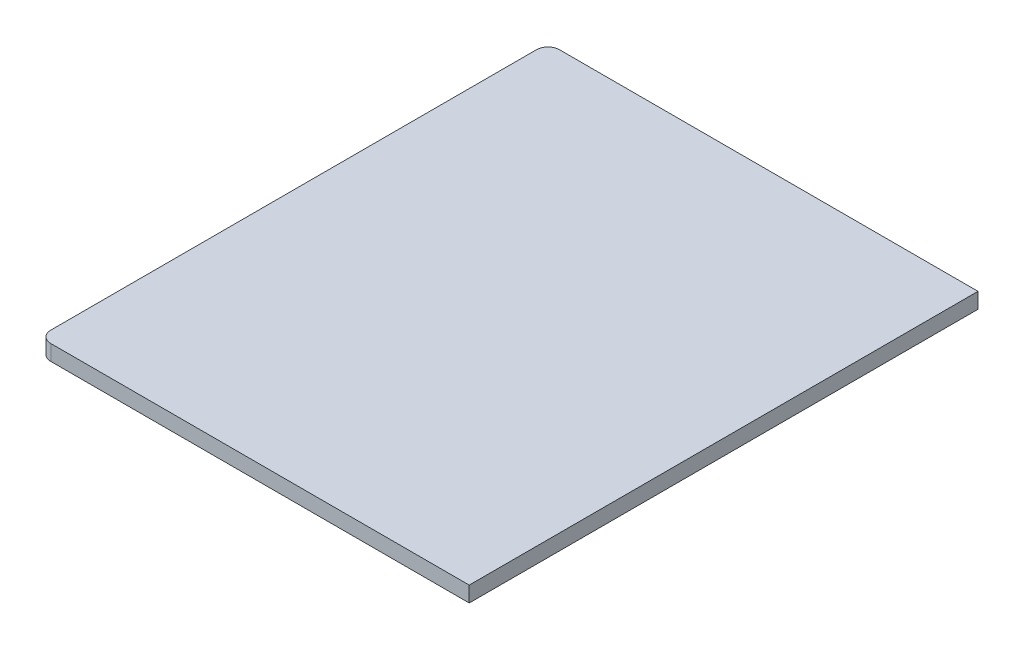
ISO-10303-21;
HEADER;
FILE_DESCRIPTION(('STEP AP214'),'2;1');
FILE_NAME('part.step','',(''),(''),'','','');
FILE_SCHEMA(('AUTOMOTIVE_DESIGN { 1 0 10303 214 1 1 1 1 }'));
ENDSEC;
DATA;
#1=APPLICATION_CONTEXT('core data for automotive mechanical design processes');
#2=APPLICATION_PROTOCOL_DEFINITION('international standard','automotive_design',2000,#1);
#3=PRODUCT_CONTEXT('',#1,'mechanical');
#4=PRODUCT('Part','Part','',(#3));
#5=PRODUCT_RELATED_PRODUCT_CATEGORY('part','',(#4));
#6=PRODUCT_DEFINITION_FORMATION('','',#4);
#7=PRODUCT_DEFINITION_CONTEXT('part definition',#1,'design');
#8=PRODUCT_DEFINITION('design','',#6,#7);
#9=PRODUCT_DEFINITION_SHAPE('','',#8);
#10=(LENGTH_UNIT() NAMED_UNIT(*) SI_UNIT(.MILLI.,.METRE.));
#11=(NAMED_UNIT(*) PLANE_ANGLE_UNIT() SI_UNIT($,.RADIAN.));
#12=(NAMED_UNIT(*) SI_UNIT($,.STERADIAN.) SOLID_ANGLE_UNIT());
#13=UNCERTAINTY_MEASURE_WITH_UNIT(LENGTH_MEASURE(1.E-05),#10,'distance_accuracy_value','');
#14=(GEOMETRIC_REPRESENTATION_CONTEXT(3) GLOBAL_UNCERTAINTY_ASSIGNED_CONTEXT((#13)) GLOBAL_UNIT_ASSIGNED_CONTEXT((#10,
#11,#12)) REPRESENTATION_CONTEXT('',''));
#15=CARTESIAN_POINT('',(0.,0.,0.));
#16=DIRECTION('',(0.,0.,1.));
#17=DIRECTION('',(1.,0.,0.));
#18=AXIS2_PLACEMENT_3D('',#15,#16,#17);
#19=CARTESIAN_POINT('',(-105.9,3.9,0.));
#20=DIRECTION('',(-1.,0.,0.));
#21=DIRECTION('',(0.,0.,1.));
#22=AXIS2_PLACEMENT_3D('',#19,#20,#21);
#23=PLANE('',#22);
#24=DIRECTION('',(0.,0.,-1.));
#25=VECTOR('',#24,1.);
#26=CARTESIAN_POINT('',(-105.9,0.,0.));
#27=LINE('',#26,#25);
#28=CARTESIAN_POINT('',(-105.9,0.,60.9297943852697));
#29=VERTEX_POINT('',#28);
#30=CARTESIAN_POINT('',(-105.9,0.,-60.9297943852697));
#31=VERTEX_POINT('',#30);
#32=EDGE_CURVE('E133',#29,#31,#27,.T.);
#33=ORIENTED_EDGE('',*,*,#32,.F.);
#34=DIRECTION('',(0.,-1.,0.));
#35=VECTOR('',#34,1.);
#36=CARTESIAN_POINT('',(-105.9,3.9,60.9297943852697));
#37=LINE('',#36,#35);
#38=CARTESIAN_POINT('',(-105.9,3.9,60.9297943852697));
#39=VERTEX_POINT('',#38);
#40=EDGE_CURVE('E11',#39,#29,#37,.T.);
#41=ORIENTED_EDGE('',*,*,#40,.F.);
#42=DIRECTION('',(0.,0.,-1.));
#43=VECTOR('',#42,1.);
#44=CARTESIAN_POINT('',(-105.9,3.9,0.));
#45=LINE('',#44,#43);
#46=CARTESIAN_POINT('',(-105.9,3.9,-60.9297943852697));
#47=VERTEX_POINT('',#46);
#48=EDGE_CURVE('E153',#39,#47,#45,.T.);
#49=ORIENTED_EDGE('',*,*,#48,.T.);
#50=DIRECTION('',(0.,-1.,0.));
#51=VECTOR('',#50,1.);
#52=CARTESIAN_POINT('',(-105.9,3.9,-60.9297943852697));
#53=LINE('',#52,#51);
#54=EDGE_CURVE('E92',#47,#31,#53,.T.);
#55=ORIENTED_EDGE('',*,*,#54,.T.);
#56=EDGE_LOOP('',(#33,#41,#49,#55));
#57=FACE_BOUND('',#56,.T.);
#58=ADVANCED_FACE('F47',(#57),#23,.T.);
#59=CARTESIAN_POINT('',(-103.,3.9,60.9297943852697));
#60=DIRECTION('',(0.,-1.,0.));
#61=DIRECTION('',(0.,0.,-1.));
#62=AXIS2_PLACEMENT_3D('',#59,#60,#61);
#63=CYLINDRICAL_SURFACE('',#62,2.90000000000002);
#64=CARTESIAN_POINT('',(-103.,0.,60.9297943852697));
#65=DIRECTION('',(0.,1.,0.));
#66=DIRECTION('',(0.,0.,1.));
#67=AXIS2_PLACEMENT_3D('',#64,#65,#66);
#68=CIRCLE('',#67,2.90000000000002);
#69=CARTESIAN_POINT('',(-103.,0.,63.8297943852697));
#70=VERTEX_POINT('',#69);
#71=EDGE_CURVE('E137',#29,#70,#68,.T.);
#72=ORIENTED_EDGE('',*,*,#71,.T.);
#73=DIRECTION('',(0.,-1.,0.));
#74=VECTOR('',#73,1.);
#75=CARTESIAN_POINT('',(-103.,3.9,63.8297943852697));
#76=LINE('',#75,#74);
#77=CARTESIAN_POINT('',(-103.,3.9,63.8297943852697));
#78=VERTEX_POINT('',#77);
#79=EDGE_CURVE('E56',#78,#70,#76,.T.);
#80=ORIENTED_EDGE('',*,*,#79,.F.);
#81=CARTESIAN_POINT('',(-103.,3.9,60.9297943852697));
#82=DIRECTION('',(0.,1.,0.));
#83=DIRECTION('',(0.,0.,1.));
#84=AXIS2_PLACEMENT_3D('',#81,#82,#83);
#85=CIRCLE('',#84,2.90000000000002);
#86=EDGE_CURVE('E171',#39,#78,#85,.T.);
#87=ORIENTED_EDGE('',*,*,#86,.F.);
#88=ORIENTED_EDGE('',*,*,#40,.T.);
#89=EDGE_LOOP('',(#72,#80,#87,#88));
#90=FACE_BOUND('',#89,.T.);
#91=ADVANCED_FACE('F228',(#90),#63,.T.);
#92=CARTESIAN_POINT('',(0.,3.9,63.8297943852697));
#93=DIRECTION('',(0.,0.,-1.));
#94=DIRECTION('',(-1.,0.,0.));
#95=AXIS2_PLACEMENT_3D('',#92,#93,#94);
#96=PLANE('',#95);
#97=DIRECTION('',(1.,0.,0.));
#98=VECTOR('',#97,1.);
#99=CARTESIAN_POINT('',(0.,0.,63.8297943852697));
#100=LINE('',#99,#98);
#101=CARTESIAN_POINT('',(2.,0.,63.8297943852697));
#102=VERTEX_POINT('',#101);
#103=EDGE_CURVE('E141',#70,#102,#100,.T.);
#104=ORIENTED_EDGE('',*,*,#103,.T.);
#105=DIRECTION('',(0.,-1.,0.));
#106=VECTOR('',#105,1.);
#107=CARTESIAN_POINT('',(2.,3.9,63.8297943852697));
#108=LINE('',#107,#106);
#109=CARTESIAN_POINT('',(2.,3.9,63.8297943852697));
#110=VERTEX_POINT('',#109);
#111=EDGE_CURVE('E117',#110,#102,#108,.T.);
#112=ORIENTED_EDGE('',*,*,#111,.F.);
#113=DIRECTION('',(1.,0.,0.));
#114=VECTOR('',#113,1.);
#115=CARTESIAN_POINT('',(0.,3.9,63.8297943852697));
#116=LINE('',#115,#114);
#117=EDGE_CURVE('E122',#78,#110,#116,.T.);
#118=ORIENTED_EDGE('',*,*,#117,.F.);
#119=ORIENTED_EDGE('',*,*,#79,.T.);
#120=EDGE_LOOP('',(#104,#112,#118,#119));
#121=FACE_BOUND('',#120,.T.);
#122=ADVANCED_FACE('F164',(#121),#96,.F.);
#123=CARTESIAN_POINT('',(2.,3.9,0.));
#124=DIRECTION('',(1.,0.,0.));
#125=DIRECTION('',(0.,0.,-1.));
#126=AXIS2_PLACEMENT_3D('',#123,#124,#125);
#127=PLANE('',#126);
#128=DIRECTION('',(0.,0.,1.));
#129=VECTOR('',#128,1.);
#130=CARTESIAN_POINT('',(2.,0.,0.));
#131=LINE('',#130,#129);
#132=CARTESIAN_POINT('',(2.,0.,-63.8297943852697));
#133=VERTEX_POINT('',#132);
#134=EDGE_CURVE('E111',#133,#102,#131,.T.);
#135=ORIENTED_EDGE('',*,*,#134,.F.);
#136=DIRECTION('',(0.,-1.,0.));
#137=VECTOR('',#136,1.);
#138=CARTESIAN_POINT('',(2.,3.9,-63.8297943852697));
#139=LINE('',#138,#137);
#140=CARTESIAN_POINT('',(2.,3.9,-63.8297943852697));
#141=VERTEX_POINT('',#140);
#142=EDGE_CURVE('E106',#141,#133,#139,.T.);
#143=ORIENTED_EDGE('',*,*,#142,.F.);
#144=DIRECTION('',(0.,0.,1.));
#145=VECTOR('',#144,1.);
#146=CARTESIAN_POINT('',(2.,3.9,0.));
#147=LINE('',#146,#145);
#148=EDGE_CURVE('E109',#141,#110,#147,.T.);
#149=ORIENTED_EDGE('',*,*,#148,.T.);
#150=ORIENTED_EDGE('',*,*,#111,.T.);
#151=EDGE_LOOP('',(#135,#143,#149,#150));
#152=FACE_BOUND('',#151,.T.);
#153=ADVANCED_FACE('F108',(#152),#127,.T.);
#154=CARTESIAN_POINT('',(0.,3.9,-63.8297943852697));
#155=DIRECTION('',(0.,0.,-1.));
#156=DIRECTION('',(-1.,0.,0.));
#157=AXIS2_PLACEMENT_3D('',#154,#155,#156);
#158=PLANE('',#157);
#159=DIRECTION('',(1.,0.,0.));
#160=VECTOR('',#159,1.);
#161=CARTESIAN_POINT('',(0.,0.,-63.8297943852697));
#162=LINE('',#161,#160);
#163=CARTESIAN_POINT('',(-103.,0.,-63.8297943852697));
#164=VERTEX_POINT('',#163);
#165=EDGE_CURVE('E147',#164,#133,#162,.T.);
#166=ORIENTED_EDGE('',*,*,#165,.F.);
#167=DIRECTION('',(0.,-1.,0.));
#168=VECTOR('',#167,1.);
#169=CARTESIAN_POINT('',(-103.,3.9,-63.8297943852697));
#170=LINE('',#169,#168);
#171=CARTESIAN_POINT('',(-103.,3.9,-63.8297943852697));
#172=VERTEX_POINT('',#171);
#173=EDGE_CURVE('E85',#172,#164,#170,.T.);
#174=ORIENTED_EDGE('',*,*,#173,.F.);
#175=DIRECTION('',(1.,0.,0.));
#176=VECTOR('',#175,1.);
#177=CARTESIAN_POINT('',(0.,3.9,-63.8297943852697));
#178=LINE('',#177,#176);
#179=EDGE_CURVE('E120',#172,#141,#178,.T.);
#180=ORIENTED_EDGE('',*,*,#179,.T.);
#181=ORIENTED_EDGE('',*,*,#142,.T.);
#182=EDGE_LOOP('',(#166,#174,#180,#181));
#183=FACE_BOUND('',#182,.T.);
#184=ADVANCED_FACE('F126',(#183),#158,.T.);
#185=CARTESIAN_POINT('',(-103.,3.9,-60.9297943852697));
#186=DIRECTION('',(0.,-1.,0.));
#187=DIRECTION('',(0.,0.,-1.));
#188=AXIS2_PLACEMENT_3D('',#185,#186,#187);
#189=CYLINDRICAL_SURFACE('',#188,2.90000000000002);
#190=CARTESIAN_POINT('',(-103.,0.,-60.9297943852697));
#191=DIRECTION('',(0.,1.,0.));
#192=DIRECTION('',(0.,0.,1.));
#193=AXIS2_PLACEMENT_3D('',#190,#191,#192);
#194=CIRCLE('',#193,2.90000000000002);
#195=EDGE_CURVE('E150',#164,#31,#194,.T.);
#196=ORIENTED_EDGE('',*,*,#195,.T.);
#197=ORIENTED_EDGE('',*,*,#54,.F.);
#198=CARTESIAN_POINT('',(-103.,3.9,-60.9297943852697));
#199=DIRECTION('',(0.,1.,0.));
#200=DIRECTION('',(0.,0.,1.));
#201=AXIS2_PLACEMENT_3D('',#198,#199,#200);
#202=CIRCLE('',#201,2.90000000000002);
#203=EDGE_CURVE('E64',#172,#47,#202,.T.);
#204=ORIENTED_EDGE('',*,*,#203,.F.);
#205=ORIENTED_EDGE('',*,*,#173,.T.);
#206=EDGE_LOOP('',(#196,#197,#204,#205));
#207=FACE_BOUND('',#206,.T.);
#208=ADVANCED_FACE('F169',(#207),#189,.T.);
#209=CARTESIAN_POINT('',(0.,3.9,0.));
#210=DIRECTION('',(0.,1.,0.));
#211=DIRECTION('',(0.,0.,1.));
#212=AXIS2_PLACEMENT_3D('',#209,#210,#211);
#213=PLANE('',#212);
#214=ORIENTED_EDGE('',*,*,#48,.F.);
#215=ORIENTED_EDGE('',*,*,#86,.T.);
#216=ORIENTED_EDGE('',*,*,#117,.T.);
#217=ORIENTED_EDGE('',*,*,#148,.F.);
#218=ORIENTED_EDGE('',*,*,#179,.F.);
#219=ORIENTED_EDGE('',*,*,#203,.T.);
#220=EDGE_LOOP('',(#214,#215,#216,#217,#218,#219));
#221=FACE_BOUND('',#220,.T.);
#222=ADVANCED_FACE('F119',(#221),#213,.T.);
#223=CARTESIAN_POINT('',(0.,0.,0.));
#224=DIRECTION('',(0.,1.,0.));
#225=DIRECTION('',(0.,0.,1.));
#226=AXIS2_PLACEMENT_3D('',#223,#224,#225);
#227=PLANE('',#226);
#228=CARTESIAN_POINT('',(-103.,0.,-60.9297943852697));
#229=DIRECTION('',(0.,1.,0.));
#230=DIRECTION('',(0.,0.,1.));
#231=AXIS2_PLACEMENT_3D('',#228,#229,#230);
#232=CIRCLE('',#231,2.1);
#233=CARTESIAN_POINT('',(-103.,0.,-58.8297943852697));
#234=VERTEX_POINT('',#233);
#235=EDGE_CURVE('E189',#234,#234,#232,.T.);
#236=ORIENTED_EDGE('',*,*,#235,.T.);
#237=EDGE_LOOP('',(#236));
#238=FACE_BOUND('',#237,.T.);
#239=CARTESIAN_POINT('',(-5.,0.,60.9297943852697));
#240=DIRECTION('',(0.,1.,0.));
#241=DIRECTION('',(0.,0.,1.));
#242=AXIS2_PLACEMENT_3D('',#239,#240,#241);
#243=CIRCLE('',#242,2.1);
#244=CARTESIAN_POINT('',(-5.,0.,63.0297943852697));
#245=VERTEX_POINT('',#244);
#246=EDGE_CURVE('E197',#245,#245,#243,.T.);
#247=ORIENTED_EDGE('',*,*,#246,.T.);
#248=EDGE_LOOP('',(#247));
#249=FACE_BOUND('',#248,.T.);
#250=CARTESIAN_POINT('',(-103.,0.,60.9297943852697));
#251=DIRECTION('',(0.,1.,0.));
#252=DIRECTION('',(0.,0.,1.));
#253=AXIS2_PLACEMENT_3D('',#250,#251,#252);
#254=CIRCLE('',#253,2.1);
#255=CARTESIAN_POINT('',(-103.,0.,63.0297943852697));
#256=VERTEX_POINT('',#255);
#257=EDGE_CURVE('E181',#256,#256,#254,.T.);
#258=ORIENTED_EDGE('',*,*,#257,.T.);
#259=EDGE_LOOP('',(#258));
#260=FACE_BOUND('',#259,.T.);
#261=CARTESIAN_POINT('',(-5.,0.,-60.9297943852697));
#262=DIRECTION('',(0.,1.,0.));
#263=DIRECTION('',(0.,0.,1.));
#264=AXIS2_PLACEMENT_3D('',#261,#262,#263);
#265=CIRCLE('',#264,2.1);
#266=CARTESIAN_POINT('',(-5.,0.,-58.8297943852697));
#267=VERTEX_POINT('',#266);
#268=EDGE_CURVE('E176',#267,#267,#265,.T.);
#269=ORIENTED_EDGE('',*,*,#268,.T.);
#270=EDGE_LOOP('',(#269));
#271=FACE_BOUND('',#270,.T.);
#272=ORIENTED_EDGE('',*,*,#32,.T.);
#273=ORIENTED_EDGE('',*,*,#195,.F.);
#274=ORIENTED_EDGE('',*,*,#165,.T.);
#275=ORIENTED_EDGE('',*,*,#134,.T.);
#276=ORIENTED_EDGE('',*,*,#103,.F.);
#277=ORIENTED_EDGE('',*,*,#71,.F.);
#278=EDGE_LOOP('',(#272,#273,#274,#275,#276,#277));
#279=FACE_BOUND('',#278,.T.);
#280=ADVANCED_FACE('F168',(#238,#249,#260,#271,#279),#227,.F.);
#281=CARTESIAN_POINT('',(-5.,1.6,-60.9297943852697));
#282=DIRECTION('',(0.,-1.,0.));
#283=DIRECTION('',(0.,0.,-1.));
#284=AXIS2_PLACEMENT_3D('',#281,#282,#283);
#285=CYLINDRICAL_SURFACE('',#284,2.1);
#286=CARTESIAN_POINT('',(-5.,1.6,-60.9297943852697));
#287=DIRECTION('',(0.,1.,0.));
#288=DIRECTION('',(0.,0.,1.));
#289=AXIS2_PLACEMENT_3D('',#286,#287,#288);
#290=CIRCLE('',#289,2.1);
#291=CARTESIAN_POINT('',(-5.,1.6,-58.8297943852697));
#292=VERTEX_POINT('',#291);
#293=EDGE_CURVE('E138',#292,#292,#290,.T.);
#294=ORIENTED_EDGE('',*,*,#293,.T.);
#295=EDGE_LOOP('',(#294));
#296=FACE_BOUND('',#295,.T.);
#297=ORIENTED_EDGE('',*,*,#268,.F.);
#298=EDGE_LOOP('',(#297));
#299=FACE_BOUND('',#298,.T.);
#300=ADVANCED_FACE('F224',(#296,#299),#285,.F.);
#301=CARTESIAN_POINT('',(0.,1.6,0.));
#302=DIRECTION('',(0.,1.,0.));
#303=DIRECTION('',(0.,0.,1.));
#304=AXIS2_PLACEMENT_3D('',#301,#302,#303);
#305=PLANE('',#304);
#306=ORIENTED_EDGE('',*,*,#293,.F.);
#307=EDGE_LOOP('',(#306));
#308=FACE_BOUND('',#307,.T.);
#309=ADVANCED_FACE('F214',(#308),#305,.F.);
#310=CARTESIAN_POINT('',(-103.,1.6,60.9297943852697));
#311=DIRECTION('',(0.,-1.,0.));
#312=DIRECTION('',(0.,0.,-1.));
#313=AXIS2_PLACEMENT_3D('',#310,#311,#312);
#314=CYLINDRICAL_SURFACE('',#313,2.1);
#315=CARTESIAN_POINT('',(-103.,1.6,60.9297943852697));
#316=DIRECTION('',(0.,1.,0.));
#317=DIRECTION('',(0.,0.,1.));
#318=AXIS2_PLACEMENT_3D('',#315,#316,#317);
#319=CIRCLE('',#318,2.1);
#320=CARTESIAN_POINT('',(-103.,1.6,63.0297943852697));
#321=VERTEX_POINT('',#320);
#322=EDGE_CURVE('E201',#321,#321,#319,.T.);
#323=ORIENTED_EDGE('',*,*,#322,.T.);
#324=EDGE_LOOP('',(#323));
#325=FACE_BOUND('',#324,.T.);
#326=ORIENTED_EDGE('',*,*,#257,.F.);
#327=EDGE_LOOP('',(#326));
#328=FACE_BOUND('',#327,.T.);
#329=ADVANCED_FACE('F211',(#325,#328),#314,.F.);
#330=CARTESIAN_POINT('',(0.,1.6,0.));
#331=DIRECTION('',(0.,1.,0.));
#332=DIRECTION('',(0.,0.,1.));
#333=AXIS2_PLACEMENT_3D('',#330,#331,#332);
#334=PLANE('',#333);
#335=ORIENTED_EDGE('',*,*,#322,.F.);
#336=EDGE_LOOP('',(#335));
#337=FACE_BOUND('',#336,.T.);
#338=ADVANCED_FACE('F213',(#337),#334,.F.);
#339=CARTESIAN_POINT('',(-5.,1.6,60.9297943852697));
#340=DIRECTION('',(0.,-1.,0.));
#341=DIRECTION('',(0.,0.,-1.));
#342=AXIS2_PLACEMENT_3D('',#339,#340,#341);
#343=CYLINDRICAL_SURFACE('',#342,2.1);
#344=CARTESIAN_POINT('',(-5.,1.6,60.9297943852697));
#345=DIRECTION('',(0.,1.,0.));
#346=DIRECTION('',(0.,0.,1.));
#347=AXIS2_PLACEMENT_3D('',#344,#345,#346);
#348=CIRCLE('',#347,2.1);
#349=CARTESIAN_POINT('',(-5.,1.6,63.0297943852697));
#350=VERTEX_POINT('',#349);
#351=EDGE_CURVE('E193',#350,#350,#348,.T.);
#352=ORIENTED_EDGE('',*,*,#351,.T.);
#353=EDGE_LOOP('',(#352));
#354=FACE_BOUND('',#353,.T.);
#355=ORIENTED_EDGE('',*,*,#246,.F.);
#356=EDGE_LOOP('',(#355));
#357=FACE_BOUND('',#356,.T.);
#358=ADVANCED_FACE('F221',(#354,#357),#343,.F.);
#359=CARTESIAN_POINT('',(0.,1.6,0.));
#360=DIRECTION('',(0.,1.,0.));
#361=DIRECTION('',(0.,0.,1.));
#362=AXIS2_PLACEMENT_3D('',#359,#360,#361);
#363=PLANE('',#362);
#364=ORIENTED_EDGE('',*,*,#351,.F.);
#365=EDGE_LOOP('',(#364));
#366=FACE_BOUND('',#365,.T.);
#367=ADVANCED_FACE('F258',(#366),#363,.F.);
#368=CARTESIAN_POINT('',(-103.,1.6,-60.9297943852697));
#369=DIRECTION('',(0.,-1.,0.));
#370=DIRECTION('',(0.,0.,-1.));
#371=AXIS2_PLACEMENT_3D('',#368,#369,#370);
#372=CYLINDRICAL_SURFACE('',#371,2.1);
#373=CARTESIAN_POINT('',(-103.,1.6,-60.9297943852697));
#374=DIRECTION('',(0.,1.,0.));
#375=DIRECTION('',(0.,0.,1.));
#376=AXIS2_PLACEMENT_3D('',#373,#374,#375);
#377=CIRCLE('',#376,2.1);
#378=CARTESIAN_POINT('',(-103.,1.6,-58.8297943852697));
#379=VERTEX_POINT('',#378);
#380=EDGE_CURVE('E185',#379,#379,#377,.T.);
#381=ORIENTED_EDGE('',*,*,#380,.T.);
#382=EDGE_LOOP('',(#381));
#383=FACE_BOUND('',#382,.T.);
#384=ORIENTED_EDGE('',*,*,#235,.F.);
#385=EDGE_LOOP('',(#384));
#386=FACE_BOUND('',#385,.T.);
#387=ADVANCED_FACE('F254',(#383,#386),#372,.F.);
#388=CARTESIAN_POINT('',(-103.,1.6,-60.9297943852697));
#389=DIRECTION('',(0.,1.,0.));
#390=DIRECTION('',(0.,0.,1.));
#391=AXIS2_PLACEMENT_3D('',#388,#389,#390);
#392=PLANE('',#391);
#393=ORIENTED_EDGE('',*,*,#380,.F.);
#394=EDGE_LOOP('',(#393));
#395=FACE_BOUND('',#394,.T.);
#396=ADVANCED_FACE('F251',(#395),#392,.F.);
#397=CLOSED_SHELL('',(#58,#91,#122,#153,#184,#208,#222,#280,#300,#309,#329,#338,#358,#367,#387,#396));
#398=MANIFOLD_SOLID_BREP('B2',#397);
#399=ADVANCED_BREP_SHAPE_REPRESENTATION('',(#18,#398),#14);
#400=SHAPE_DEFINITION_REPRESENTATION(#9,#399);
ENDSEC;
END-ISO-10303-21;
